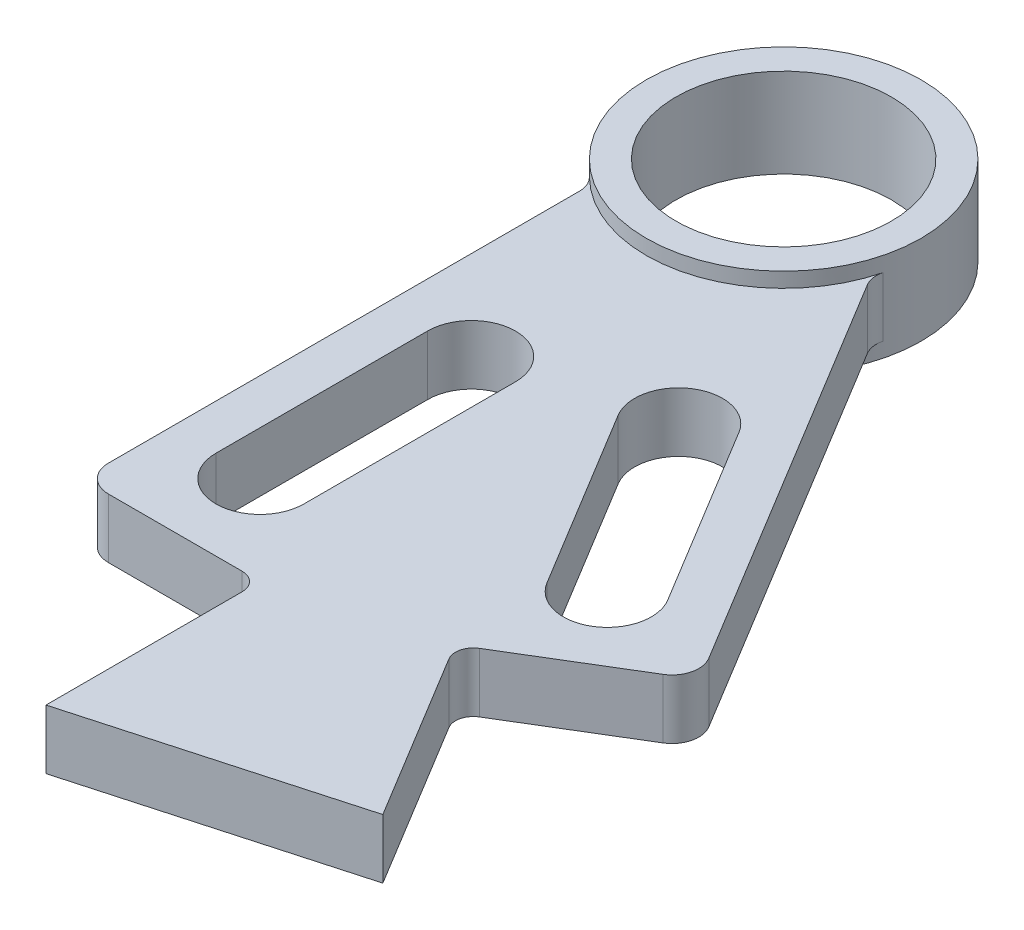
ISO-10303-21;
HEADER;
FILE_DESCRIPTION(('STEP AP214'),'2;1');
FILE_NAME('part.step','',(''),(''),'','','');
FILE_SCHEMA(('AUTOMOTIVE_DESIGN { 1 0 10303 214 1 1 1 1 }'));
ENDSEC;
DATA;
#1=APPLICATION_CONTEXT('core data for automotive mechanical design processes');
#2=APPLICATION_PROTOCOL_DEFINITION('international standard','automotive_design',2000,#1);
#3=PRODUCT_CONTEXT('',#1,'mechanical');
#4=PRODUCT('Part','Part','',(#3));
#5=PRODUCT_RELATED_PRODUCT_CATEGORY('part','',(#4));
#6=PRODUCT_DEFINITION_FORMATION('','',#4);
#7=PRODUCT_DEFINITION_CONTEXT('part definition',#1,'design');
#8=PRODUCT_DEFINITION('design','',#6,#7);
#9=PRODUCT_DEFINITION_SHAPE('','',#8);
#10=(LENGTH_UNIT() NAMED_UNIT(*) SI_UNIT(.MILLI.,.METRE.));
#11=(NAMED_UNIT(*) PLANE_ANGLE_UNIT() SI_UNIT($,.RADIAN.));
#12=(NAMED_UNIT(*) SI_UNIT($,.STERADIAN.) SOLID_ANGLE_UNIT());
#13=UNCERTAINTY_MEASURE_WITH_UNIT(LENGTH_MEASURE(1.E-05),#10,'distance_accuracy_value','');
#14=(GEOMETRIC_REPRESENTATION_CONTEXT(3) GLOBAL_UNCERTAINTY_ASSIGNED_CONTEXT((#13)) GLOBAL_UNIT_ASSIGNED_CONTEXT((#10,
#11,#12)) REPRESENTATION_CONTEXT('',''));
#15=CARTESIAN_POINT('',(0.,0.,0.));
#16=DIRECTION('',(0.,0.,1.));
#17=DIRECTION('',(1.,0.,0.));
#18=AXIS2_PLACEMENT_3D('',#15,#16,#17);
#19=CARTESIAN_POINT('',(0.,4.7625,0.));
#20=DIRECTION('',(0.,-1.,0.));
#21=DIRECTION('',(0.,0.,-1.));
#22=AXIS2_PLACEMENT_3D('',#19,#20,#21);
#23=CYLINDRICAL_SURFACE('',#22,11.5062);
#24=CARTESIAN_POINT('',(0.,4.7625,0.));
#25=DIRECTION('',(0.,1.,0.));
#26=DIRECTION('',(0.,0.,1.));
#27=AXIS2_PLACEMENT_3D('',#24,#25,#26);
#28=CIRCLE('',#27,11.5062);
#29=CARTESIAN_POINT('',(0.,4.7625,-11.5062));
#30=VERTEX_POINT('',#29);
#31=EDGE_CURVE('E309',#30,#30,#28,.T.);
#32=CARTESIAN_POINT('',(0.,-4.7625,0.));
#33=DIRECTION('',(0.,1.,0.));
#34=DIRECTION('',(0.,0.,1.));
#35=AXIS2_PLACEMENT_3D('',#32,#33,#34);
#36=CIRCLE('',#35,11.5062);
#37=CARTESIAN_POINT('',(0.,-4.7625,-11.5062));
#38=VERTEX_POINT('',#37);
#39=EDGE_CURVE('E300',#38,#38,#36,.T.);
#40=CARTESIAN_POINT('',(0.,4.7625,-11.5062));
#41=CARTESIAN_POINT('',(0.,4.66328125,-11.5062));
#42=CARTESIAN_POINT('',(0.,4.5640625,-11.5062));
#43=CARTESIAN_POINT('',(0.,4.365625,-11.5062));
#44=CARTESIAN_POINT('',(0.,4.26640625,-11.5062));
#45=CARTESIAN_POINT('',(0.,4.06796875,-11.5062));
#46=CARTESIAN_POINT('',(0.,3.96875,-11.5062));
#47=CARTESIAN_POINT('',(0.,3.7703125,-11.5062));
#48=CARTESIAN_POINT('',(0.,3.67109375,-11.5062));
#49=CARTESIAN_POINT('',(0.,3.47265625,-11.5062));
#50=CARTESIAN_POINT('',(0.,3.3734375,-11.5062));
#51=CARTESIAN_POINT('',(0.,3.175,-11.5062));
#52=CARTESIAN_POINT('',(0.,3.07578125,-11.5062));
#53=CARTESIAN_POINT('',(0.,2.87734375,-11.5062));
#54=CARTESIAN_POINT('',(0.,2.778125,-11.5062));
#55=CARTESIAN_POINT('',(0.,2.5796875,-11.5062));
#56=CARTESIAN_POINT('',(0.,2.48046875,-11.5062));
#57=CARTESIAN_POINT('',(0.,2.28203125,-11.5062));
#58=CARTESIAN_POINT('',(0.,2.1828125,-11.5062));
#59=CARTESIAN_POINT('',(0.,1.984375,-11.5062));
#60=CARTESIAN_POINT('',(0.,1.88515625,-11.5062));
#61=CARTESIAN_POINT('',(0.,1.68671875,-11.5062));
#62=CARTESIAN_POINT('',(0.,1.5875,-11.5062));
#63=CARTESIAN_POINT('',(0.,1.3890625,-11.5062));
#64=CARTESIAN_POINT('',(0.,1.28984375,-11.5062));
#65=CARTESIAN_POINT('',(0.,1.09140625,-11.5062));
#66=CARTESIAN_POINT('',(0.,0.992187499999999,-11.5062));
#67=CARTESIAN_POINT('',(0.,0.79375,-11.5062));
#68=CARTESIAN_POINT('',(0.,0.69453125,-11.5062));
#69=CARTESIAN_POINT('',(0.,0.49609375,-11.5062));
#70=CARTESIAN_POINT('',(0.,0.396875,-11.5062));
#71=CARTESIAN_POINT('',(0.,0.1984375,-11.5062));
#72=CARTESIAN_POINT('',(0.,0.0992187500000001,-11.5062));
#73=CARTESIAN_POINT('',(0.,-0.0992187500000001,-11.5062));
#74=CARTESIAN_POINT('',(0.,-0.1984375,-11.5062));
#75=CARTESIAN_POINT('',(0.,-0.396875,-11.5062));
#76=CARTESIAN_POINT('',(0.,-0.49609375,-11.5062));
#77=CARTESIAN_POINT('',(0.,-0.69453125,-11.5062));
#78=CARTESIAN_POINT('',(0.,-0.793750000000001,-11.5062));
#79=CARTESIAN_POINT('',(0.,-0.992187500000001,-11.5062));
#80=CARTESIAN_POINT('',(0.,-1.09140625,-11.5062));
#81=CARTESIAN_POINT('',(0.,-1.28984375,-11.5062));
#82=CARTESIAN_POINT('',(0.,-1.3890625,-11.5062));
#83=CARTESIAN_POINT('',(0.,-1.5875,-11.5062));
#84=CARTESIAN_POINT('',(0.,-1.68671875,-11.5062));
#85=CARTESIAN_POINT('',(0.,-1.88515625,-11.5062));
#86=CARTESIAN_POINT('',(0.,-1.984375,-11.5062));
#87=CARTESIAN_POINT('',(0.,-2.1828125,-11.5062));
#88=CARTESIAN_POINT('',(0.,-2.28203125,-11.5062));
#89=CARTESIAN_POINT('',(0.,-2.48046875,-11.5062));
#90=CARTESIAN_POINT('',(0.,-2.5796875,-11.5062));
#91=CARTESIAN_POINT('',(0.,-2.778125,-11.5062));
#92=CARTESIAN_POINT('',(0.,-2.87734375,-11.5062));
#93=CARTESIAN_POINT('',(0.,-3.07578125,-11.5062));
#94=CARTESIAN_POINT('',(0.,-3.175,-11.5062));
#95=CARTESIAN_POINT('',(0.,-3.3734375,-11.5062));
#96=CARTESIAN_POINT('',(0.,-3.47265625,-11.5062));
#97=CARTESIAN_POINT('',(0.,-3.67109375,-11.5062));
#98=CARTESIAN_POINT('',(0.,-3.7703125,-11.5062));
#99=CARTESIAN_POINT('',(0.,-3.96875,-11.5062));
#100=CARTESIAN_POINT('',(0.,-4.06796875,-11.5062));
#101=CARTESIAN_POINT('',(0.,-4.26640625,-11.5062));
#102=CARTESIAN_POINT('',(0.,-4.365625,-11.5062));
#103=CARTESIAN_POINT('',(0.,-4.5640625,-11.5062));
#104=CARTESIAN_POINT('',(0.,-4.66328125,-11.5062));
#105=CARTESIAN_POINT('',(0.,-4.7625,-11.5062));
#106=B_SPLINE_CURVE_WITH_KNOTS('',3,(#40,#41,#42,#43,#44,#45,#46,#47,#48,#49,#50,#51,#52,#53,
#54,#55,#56,#57,#58,#59,#60,#61,#62,#63,#64,#65,#66,#67,#68,#69,#70,#71,#72,#73,#74,#75,#76,#77,
#78,#79,#80,#81,#82,#83,#84,#85,#86,#87,#88,#89,#90,#91,#92,#93,#94,#95,#96,#97,#98,#99,#100,
#101,#102,#103,#104,#105),.UNSPECIFIED.,.F.,.F.,(4,2,2,2,2,2,2,2,2,2,2,2,2,2,2,2,2,2,2,2,2,2,2,
2,2,2,2,2,2,2,2,2,4),(0.,0.29765625,0.5953125,0.892968750000001,1.190625,1.48828125,1.7859375,
2.08359375,2.38125,2.67890625,2.9765625,3.27421875,3.571875,3.86953125,4.1671875,4.46484375,
4.7625,5.06015625,5.3578125,5.65546875,5.953125,6.25078125,6.5484375,6.84609375,7.14375,
7.44140625,7.7390625,8.03671875,8.334375,8.63203125,8.9296875,9.22734375,9.525),.UNSPECIFIED.);
#107=EDGE_CURVE('BSEAM45',#30,#38,#106,.T.);
#108=ORIENTED_EDGE('',*,*,#31,.T.);
#109=ORIENTED_EDGE('',*,*,#39,.F.);
#110=ORIENTED_EDGE('',*,*,#107,.T.);
#111=ORIENTED_EDGE('',*,*,#107,.F.);
#112=EDGE_LOOP('',(#108,#110,#109,#111));
#113=FACE_BOUND('',#112,.T.);
#114=ADVANCED_FACE('F45',(#113),#23,.F.);
#115=CARTESIAN_POINT('',(0.,4.7625,0.));
#116=DIRECTION('',(0.,-1.,0.));
#117=DIRECTION('',(0.,0.,-1.));
#118=AXIS2_PLACEMENT_3D('',#115,#116,#117);
#119=CYLINDRICAL_SURFACE('',#118,14.6812);
#120=DIRECTION('',(0.,-1.,0.));
#121=VECTOR('',#120,1.);
#122=CARTESIAN_POINT('',(14.2263906039101,4.7625,3.62594040560217));
#123=LINE('',#122,#121);
#124=CARTESIAN_POINT('',(14.2263906039101,3.175,3.62594040560217));
#125=VERTEX_POINT('',#124);
#126=CARTESIAN_POINT('',(14.2263906039101,-3.175,3.62594040560217));
#127=VERTEX_POINT('',#126);
#128=EDGE_CURVE('E323',#125,#127,#123,.T.);
#129=ORIENTED_EDGE('',*,*,#128,.T.);
#130=CARTESIAN_POINT('',(0.,-3.175,0.));
#131=DIRECTION('',(0.,1.,0.));
#132=DIRECTION('',(0.,0.,1.));
#133=AXIS2_PLACEMENT_3D('',#130,#131,#132);
#134=CIRCLE('',#133,14.6812);
#135=CARTESIAN_POINT('',(-10.2855014749263,-3.175,10.4759769400896));
#136=VERTEX_POINT('',#135);
#137=EDGE_CURVE('E269',#136,#127,#134,.T.);
#138=ORIENTED_EDGE('',*,*,#137,.F.);
#139=DIRECTION('',(0.,-1.,0.));
#140=VECTOR('',#139,1.);
#141=CARTESIAN_POINT('',(-10.2855014749263,4.7625,10.4759769400896));
#142=LINE('',#141,#140);
#143=CARTESIAN_POINT('',(-10.2855014749263,3.175,10.4759769400896));
#144=VERTEX_POINT('',#143);
#145=EDGE_CURVE('E316',#136,#144,#142,.F.);
#146=ORIENTED_EDGE('',*,*,#145,.T.);
#147=CARTESIAN_POINT('',(0.,3.175,0.));
#148=DIRECTION('',(0.,1.,0.));
#149=DIRECTION('',(0.,0.,1.));
#150=AXIS2_PLACEMENT_3D('',#147,#148,#149);
#151=CIRCLE('',#150,14.6812);
#152=EDGE_CURVE('E230',#144,#125,#151,.T.);
#153=ORIENTED_EDGE('',*,*,#152,.T.);
#154=EDGE_LOOP('',(#129,#138,#146,#153));
#155=FACE_BOUND('',#154,.T.);
#156=CARTESIAN_POINT('',(0.,4.7625,0.));
#157=DIRECTION('',(0.,1.,0.));
#158=DIRECTION('',(0.,0.,1.));
#159=AXIS2_PLACEMENT_3D('',#156,#157,#158);
#160=CIRCLE('',#159,14.6812);
#161=CARTESIAN_POINT('',(0.,4.7625,14.6812));
#162=VERTEX_POINT('',#161);
#163=EDGE_CURVE('E312',#162,#162,#160,.T.);
#164=ORIENTED_EDGE('',*,*,#163,.F.);
#165=EDGE_LOOP('',(#164));
#166=FACE_BOUND('',#165,.T.);
#167=CARTESIAN_POINT('',(0.,-4.7625,0.));
#168=DIRECTION('',(0.,1.,0.));
#169=DIRECTION('',(0.,0.,1.));
#170=AXIS2_PLACEMENT_3D('',#167,#168,#169);
#171=CIRCLE('',#170,14.6812);
#172=CARTESIAN_POINT('',(0.,-4.7625,14.6812));
#173=VERTEX_POINT('',#172);
#174=EDGE_CURVE('E313',#173,#173,#171,.T.);
#175=ORIENTED_EDGE('',*,*,#174,.T.);
#176=EDGE_LOOP('',(#175));
#177=FACE_BOUND('',#176,.T.);
#178=ADVANCED_FACE('F428',(#155,#166,#177),#119,.T.);
#179=CARTESIAN_POINT('',(0.,4.7625,0.));
#180=DIRECTION('',(0.,1.,0.));
#181=DIRECTION('',(0.,0.,1.));
#182=AXIS2_PLACEMENT_3D('',#179,#180,#181);
#183=PLANE('',#182);
#184=ORIENTED_EDGE('',*,*,#31,.F.);
#185=EDGE_LOOP('',(#184));
#186=FACE_BOUND('',#185,.T.);
#187=ORIENTED_EDGE('',*,*,#163,.T.);
#188=EDGE_LOOP('',(#187));
#189=FACE_BOUND('',#188,.T.);
#190=ADVANCED_FACE('F447',(#186,#189),#183,.T.);
#191=CARTESIAN_POINT('',(0.,-4.7625,0.));
#192=DIRECTION('',(0.,1.,0.));
#193=DIRECTION('',(0.,0.,1.));
#194=AXIS2_PLACEMENT_3D('',#191,#192,#193);
#195=PLANE('',#194);
#196=ORIENTED_EDGE('',*,*,#39,.T.);
#197=EDGE_LOOP('',(#196));
#198=FACE_BOUND('',#197,.T.);
#199=ORIENTED_EDGE('',*,*,#174,.F.);
#200=EDGE_LOOP('',(#199));
#201=FACE_BOUND('',#200,.T.);
#202=ADVANCED_FACE('F628',(#198,#201),#195,.F.);
#203=CARTESIAN_POINT('',(0.,3.175,33.3502));
#204=DIRECTION('',(0.,-1.,0.));
#205=DIRECTION('',(0.,0.,-1.));
#206=AXIS2_PLACEMENT_3D('',#203,#204,#205);
#207=CYLINDRICAL_SURFACE('',#206,4.699);
#208=CARTESIAN_POINT('',(0.,-3.175,33.3502));
#209=DIRECTION('',(0.,1.,0.));
#210=DIRECTION('',(0.,0.,1.));
#211=AXIS2_PLACEMENT_3D('',#208,#209,#210);
#212=CIRCLE('',#211,4.699);
#213=CARTESIAN_POINT('',(4.699,-3.175,33.3502));
#214=VERTEX_POINT('',#213);
#215=CARTESIAN_POINT('',(-4.699,-3.175,33.3502));
#216=VERTEX_POINT('',#215);
#217=EDGE_CURVE('E280',#214,#216,#212,.T.);
#218=ORIENTED_EDGE('',*,*,#217,.F.);
#219=DIRECTION('',(0.,-1.,0.));
#220=VECTOR('',#219,1.);
#221=CARTESIAN_POINT('',(4.699,3.175,33.3502));
#222=LINE('',#221,#220);
#223=CARTESIAN_POINT('',(4.699,3.175,33.3502));
#224=VERTEX_POINT('',#223);
#225=EDGE_CURVE('E298',#224,#214,#222,.T.);
#226=ORIENTED_EDGE('',*,*,#225,.F.);
#227=CARTESIAN_POINT('',(0.,3.175,33.3502));
#228=DIRECTION('',(0.,1.,0.));
#229=DIRECTION('',(0.,0.,1.));
#230=AXIS2_PLACEMENT_3D('',#227,#228,#229);
#231=CIRCLE('',#230,4.699);
#232=CARTESIAN_POINT('',(-4.699,3.175,33.3502));
#233=VERTEX_POINT('',#232);
#234=EDGE_CURVE('E241',#224,#233,#231,.T.);
#235=ORIENTED_EDGE('',*,*,#234,.T.);
#236=DIRECTION('',(0.,-1.,0.));
#237=VECTOR('',#236,1.);
#238=CARTESIAN_POINT('',(-4.699,3.175,33.3502));
#239=LINE('',#238,#237);
#240=EDGE_CURVE('E291',#233,#216,#239,.T.);
#241=ORIENTED_EDGE('',*,*,#240,.T.);
#242=EDGE_LOOP('',(#218,#226,#235,#241));
#243=FACE_BOUND('',#242,.T.);
#244=ADVANCED_FACE('F619',(#243),#207,.F.);
#245=CARTESIAN_POINT('',(4.699,3.175,0.));
#246=DIRECTION('',(-1.,0.,0.));
#247=DIRECTION('',(0.,0.,1.));
#248=AXIS2_PLACEMENT_3D('',#245,#246,#247);
#249=PLANE('',#248);
#250=DIRECTION('',(0.,0.,-1.));
#251=VECTOR('',#250,1.);
#252=CARTESIAN_POINT('',(4.699,-3.175,0.));
#253=LINE('',#252,#251);
#254=CARTESIAN_POINT('',(4.699,-3.175,55.9562));
#255=VERTEX_POINT('',#254);
#256=EDGE_CURVE('E283',#255,#214,#253,.T.);
#257=ORIENTED_EDGE('',*,*,#256,.F.);
#258=DIRECTION('',(0.,-1.,0.));
#259=VECTOR('',#258,1.);
#260=CARTESIAN_POINT('',(4.699,3.175,55.9562));
#261=LINE('',#260,#259);
#262=CARTESIAN_POINT('',(4.699,3.175,55.9562));
#263=VERTEX_POINT('',#262);
#264=EDGE_CURVE('E296',#263,#255,#261,.T.);
#265=ORIENTED_EDGE('',*,*,#264,.F.);
#266=DIRECTION('',(0.,0.,-1.));
#267=VECTOR('',#266,1.);
#268=CARTESIAN_POINT('',(4.699,3.175,0.));
#269=LINE('',#268,#267);
#270=EDGE_CURVE('E244',#263,#224,#269,.T.);
#271=ORIENTED_EDGE('',*,*,#270,.T.);
#272=ORIENTED_EDGE('',*,*,#225,.T.);
#273=EDGE_LOOP('',(#257,#265,#271,#272));
#274=FACE_BOUND('',#273,.T.);
#275=ADVANCED_FACE('F610',(#274),#249,.T.);
#276=CARTESIAN_POINT('',(0.,3.175,55.9562));
#277=DIRECTION('',(0.,-1.,0.));
#278=DIRECTION('',(0.,0.,-1.));
#279=AXIS2_PLACEMENT_3D('',#276,#277,#278);
#280=CYLINDRICAL_SURFACE('',#279,4.699);
#281=CARTESIAN_POINT('',(0.,-3.175,55.9562));
#282=DIRECTION('',(0.,1.,0.));
#283=DIRECTION('',(0.,0.,1.));
#284=AXIS2_PLACEMENT_3D('',#281,#282,#283);
#285=CIRCLE('',#284,4.699);
#286=CARTESIAN_POINT('',(-4.699,-3.175,55.9562));
#287=VERTEX_POINT('',#286);
#288=EDGE_CURVE('E286',#287,#255,#285,.T.);
#289=ORIENTED_EDGE('',*,*,#288,.F.);
#290=DIRECTION('',(0.,-1.,0.));
#291=VECTOR('',#290,1.);
#292=CARTESIAN_POINT('',(-4.699,3.175,55.9562));
#293=LINE('',#292,#291);
#294=CARTESIAN_POINT('',(-4.699,3.175,55.9562));
#295=VERTEX_POINT('',#294);
#296=EDGE_CURVE('E293',#295,#287,#293,.T.);
#297=ORIENTED_EDGE('',*,*,#296,.F.);
#298=CARTESIAN_POINT('',(0.,3.175,55.9562));
#299=DIRECTION('',(0.,1.,0.));
#300=DIRECTION('',(0.,0.,1.));
#301=AXIS2_PLACEMENT_3D('',#298,#299,#300);
#302=CIRCLE('',#301,4.699);
#303=EDGE_CURVE('E247',#295,#263,#302,.T.);
#304=ORIENTED_EDGE('',*,*,#303,.T.);
#305=ORIENTED_EDGE('',*,*,#264,.T.);
#306=EDGE_LOOP('',(#289,#297,#304,#305));
#307=FACE_BOUND('',#306,.T.);
#308=ADVANCED_FACE('F602',(#307),#280,.F.);
#309=CARTESIAN_POINT('',(-8.14503074966691,3.175,4.93802582890944));
#310=DIRECTION('',(0.855121338547725,0.,-0.518427908546934));
#311=DIRECTION('',(-0.518427908546934,0.,-0.855121338547725));
#312=AXIS2_PLACEMENT_3D('',#309,#310,#311);
#313=PLANE('',#312);
#314=DIRECTION('',(0.518427908546934,0.,0.855121338547725));
#315=VECTOR('',#314,1.);
#316=CARTESIAN_POINT('',(-8.14503074966691,-3.175,4.93802582890944));
#317=LINE('',#316,#315);
#318=CARTESIAN_POINT('',(26.7898559812585,-3.175,62.5614033725541));
#319=VERTEX_POINT('',#318);
#320=CARTESIAN_POINT('',(37.6535128048595,-3.175,80.4804710218217));
#321=VERTEX_POINT('',#320);
#322=EDGE_CURVE('E262',#319,#321,#317,.T.);
#323=ORIENTED_EDGE('',*,*,#322,.F.);
#324=DIRECTION('',(0.,-1.,0.));
#325=VECTOR('',#324,1.);
#326=CARTESIAN_POINT('',(26.7898559812585,3.175,62.5614033725541));
#327=LINE('',#326,#325);
#328=CARTESIAN_POINT('',(26.7898559812585,3.175,62.5614033725541));
#329=VERTEX_POINT('',#328);
#330=EDGE_CURVE('E347',#319,#329,#327,.F.);
#331=ORIENTED_EDGE('',*,*,#330,.T.);
#332=DIRECTION('',(0.518427908546934,0.,0.855121338547725));
#333=VECTOR('',#332,1.);
#334=CARTESIAN_POINT('',(-8.14503074966691,3.175,4.93802582890944));
#335=LINE('',#334,#333);
#336=CARTESIAN_POINT('',(37.6535128048595,3.175,80.4804710218217));
#337=VERTEX_POINT('',#336);
#338=EDGE_CURVE('E223',#329,#337,#335,.T.);
#339=ORIENTED_EDGE('',*,*,#338,.T.);
#340=DIRECTION('',(0.,-1.,0.));
#341=VECTOR('',#340,1.);
#342=CARTESIAN_POINT('',(37.6535128048595,3.175,80.4804710218217));
#343=LINE('',#342,#341);
#344=EDGE_CURVE('E203',#337,#321,#343,.T.);
#345=ORIENTED_EDGE('',*,*,#344,.T.);
#346=EDGE_LOOP('',(#323,#331,#339,#345));
#347=FACE_BOUND('',#346,.T.);
#348=ADVANCED_FACE('F472',(#347),#313,.T.);
#349=CARTESIAN_POINT('',(33.9472815651437,3.175,55.9943713937111));
#350=DIRECTION('',(-0.518427908546937,0.,-0.855121338547722));
#351=DIRECTION('',(-0.855121338547723,0.,0.518427908546937));
#352=AXIS2_PLACEMENT_3D('',#349,#350,#351);
#353=PLANE('',#352);
#354=DIRECTION('',(0.855121338547722,0.,-0.518427908546937));
#355=VECTOR('',#354,1.);
#356=CARTESIAN_POINT('',(33.9472815651437,-3.175,55.9943713937111));
#357=LINE('',#356,#355);
#358=CARTESIAN_POINT('',(27.43125696541,-3.175,59.9447920568388));
#359=VERTEX_POINT('',#358);
#360=CARTESIAN_POINT('',(39.6488030899106,-3.175,52.5377533134744));
#361=VERTEX_POINT('',#360);
#362=EDGE_CURVE('E264',#359,#361,#357,.T.);
#363=ORIENTED_EDGE('',*,*,#362,.T.);
#364=DIRECTION('',(0.,-1.,0.));
#365=VECTOR('',#364,1.);
#366=CARTESIAN_POINT('',(39.6488030899106,3.175,52.5377533134744));
#367=LINE('',#366,#365);
#368=CARTESIAN_POINT('',(39.6488030899106,3.175,52.5377533134744));
#369=VERTEX_POINT('',#368);
#370=EDGE_CURVE('E371',#361,#369,#367,.F.);
#371=ORIENTED_EDGE('',*,*,#370,.T.);
#372=DIRECTION('',(0.855121338547722,0.,-0.518427908546937));
#373=VECTOR('',#372,1.);
#374=CARTESIAN_POINT('',(33.9472815651437,3.175,55.9943713937111));
#375=LINE('',#374,#373);
#376=CARTESIAN_POINT('',(27.43125696541,3.175,59.9447920568388));
#377=VERTEX_POINT('',#376);
#378=EDGE_CURVE('E225',#377,#369,#375,.T.);
#379=ORIENTED_EDGE('',*,*,#378,.F.);
#380=DIRECTION('',(0.,-1.,0.));
#381=VECTOR('',#380,1.);
#382=CARTESIAN_POINT('',(27.43125696541,3.175,59.9447920568388));
#383=LINE('',#382,#381);
#384=EDGE_CURVE('E344',#377,#359,#383,.T.);
#385=ORIENTED_EDGE('',*,*,#384,.T.);
#386=EDGE_LOOP('',(#363,#371,#379,#385));
#387=FACE_BOUND('',#386,.T.);
#388=ADVANCED_FACE('F411',(#387),#353,.F.);
#389=CARTESIAN_POINT('',(8.14503074966698,3.175,-4.93802582890954));
#390=DIRECTION('',(-0.855121338547722,0.,0.518427908546937));
#391=DIRECTION('',(0.518427908546938,0.,0.855121338547722));
#392=AXIS2_PLACEMENT_3D('',#389,#390,#391);
#393=PLANE('',#392);
#394=DIRECTION('',(-0.518427908546938,0.,-0.855121338547722));
#395=VECTOR('',#394,1.);
#396=CARTESIAN_POINT('',(8.14503074966698,3.175,-4.93802582890954));
#397=LINE('',#396,#395);
#398=CARTESIAN_POINT('',(40.6109045661378,3.175,48.6128363399015));
#399=VERTEX_POINT('',#398);
#400=CARTESIAN_POINT('',(14.5156956572705,3.175,5.57007262300034));
#401=VERTEX_POINT('',#400);
#402=EDGE_CURVE('E228',#399,#401,#397,.T.);
#403=ORIENTED_EDGE('',*,*,#402,.F.);
#404=DIRECTION('',(0.,-1.,0.));
#405=VECTOR('',#404,1.);
#406=CARTESIAN_POINT('',(40.6109045661378,3.175,48.6128363399015));
#407=LINE('',#406,#405);
#408=CARTESIAN_POINT('',(40.6109045661378,-3.175,48.6128363399015));
#409=VERTEX_POINT('',#408);
#410=EDGE_CURVE('E364',#399,#409,#407,.T.);
#411=ORIENTED_EDGE('',*,*,#410,.T.);
#412=DIRECTION('',(-0.518427908546938,0.,-0.855121338547722));
#413=VECTOR('',#412,1.);
#414=CARTESIAN_POINT('',(8.14503074966698,-3.175,-4.93802582890954));
#415=LINE('',#414,#413);
#416=CARTESIAN_POINT('',(14.5156956572705,-3.175,5.57007262300034));
#417=VERTEX_POINT('',#416);
#418=EDGE_CURVE('E267',#409,#417,#415,.T.);
#419=ORIENTED_EDGE('',*,*,#418,.T.);
#420=DIRECTION('',(0.,1.,0.));
#421=VECTOR('',#420,1.);
#422=CARTESIAN_POINT('',(14.5156956572705,3.175,5.57007262300034));
#423=LINE('',#422,#421);
#424=EDGE_CURVE('E326',#417,#401,#423,.T.);
#425=ORIENTED_EDGE('',*,*,#424,.T.);
#426=EDGE_LOOP('',(#403,#411,#419,#425));
#427=FACE_BOUND('',#426,.T.);
#428=ADVANCED_FACE('F420',(#427),#393,.F.);
#429=CARTESIAN_POINT('',(-9.525,3.175,0.));
#430=DIRECTION('',(-1.,0.,0.));
#431=DIRECTION('',(0.,0.,1.));
#432=AXIS2_PLACEMENT_3D('',#429,#430,#431);
#433=PLANE('',#432);
#434=DIRECTION('',(0.,0.,-1.));
#435=VECTOR('',#434,1.);
#436=CARTESIAN_POINT('',(-9.525,-3.175,0.));
#437=LINE('',#436,#435);
#438=CARTESIAN_POINT('',(-9.525,-3.175,62.6237));
#439=VERTEX_POINT('',#438);
#440=CARTESIAN_POINT('',(-9.525,-3.175,12.2884296978906));
#441=VERTEX_POINT('',#440);
#442=EDGE_CURVE('E271',#439,#441,#437,.T.);
#443=ORIENTED_EDGE('',*,*,#442,.F.);
#444=DIRECTION('',(0.,-1.,0.));
#445=VECTOR('',#444,1.);
#446=CARTESIAN_POINT('',(-9.525,3.175,62.6237));
#447=LINE('',#446,#445);
#448=CARTESIAN_POINT('',(-9.525,3.175,62.6237));
#449=VERTEX_POINT('',#448);
#450=EDGE_CURVE('E11',#439,#449,#447,.F.);
#451=ORIENTED_EDGE('',*,*,#450,.T.);
#452=DIRECTION('',(0.,0.,-1.));
#453=VECTOR('',#452,1.);
#454=CARTESIAN_POINT('',(-9.525,3.175,0.));
#455=LINE('',#454,#453);
#456=CARTESIAN_POINT('',(-9.525,3.175,12.2884296978906));
#457=VERTEX_POINT('',#456);
#458=EDGE_CURVE('E232',#449,#457,#455,.T.);
#459=ORIENTED_EDGE('',*,*,#458,.T.);
#460=DIRECTION('',(0.,-1.,0.));
#461=VECTOR('',#460,1.);
#462=CARTESIAN_POINT('',(-9.525,3.175,12.2884296978906));
#463=LINE('',#462,#461);
#464=EDGE_CURVE('E329',#457,#441,#463,.T.);
#465=ORIENTED_EDGE('',*,*,#464,.T.);
#466=EDGE_LOOP('',(#443,#451,#459,#465));
#467=FACE_BOUND('',#466,.T.);
#468=ADVANCED_FACE('F481',(#467),#433,.T.);
#469=CARTESIAN_POINT('',(0.,3.175,65.4812));
#470=DIRECTION('',(0.,0.,-1.));
#471=DIRECTION('',(-1.,0.,0.));
#472=AXIS2_PLACEMENT_3D('',#469,#470,#471);
#473=PLANE('',#472);
#474=DIRECTION('',(1.,0.,0.));
#475=VECTOR('',#474,1.);
#476=CARTESIAN_POINT('',(0.,3.175,65.4812));
#477=LINE('',#476,#475);
#478=CARTESIAN_POINT('',(-6.6675,3.175,65.4812));
#479=VERTEX_POINT('',#478);
#480=CARTESIAN_POINT('',(7.62,3.175,65.4812));
#481=VERTEX_POINT('',#480);
#482=EDGE_CURVE('E234',#479,#481,#477,.T.);
#483=ORIENTED_EDGE('',*,*,#482,.F.);
#484=DIRECTION('',(0.,-1.,0.));
#485=VECTOR('',#484,1.);
#486=CARTESIAN_POINT('',(-6.6675,-3.175,65.4812));
#487=LINE('',#486,#485);
#488=CARTESIAN_POINT('',(-6.6675,-3.175,65.4812));
#489=VERTEX_POINT('',#488);
#490=EDGE_CURVE('E53',#479,#489,#487,.T.);
#491=ORIENTED_EDGE('',*,*,#490,.T.);
#492=DIRECTION('',(1.,0.,0.));
#493=VECTOR('',#492,1.);
#494=CARTESIAN_POINT('',(0.,-3.175,65.4812));
#495=LINE('',#494,#493);
#496=CARTESIAN_POINT('',(7.62,-3.175,65.4812));
#497=VERTEX_POINT('',#496);
#498=EDGE_CURVE('E273',#489,#497,#495,.T.);
#499=ORIENTED_EDGE('',*,*,#498,.T.);
#500=DIRECTION('',(0.,-1.,0.));
#501=VECTOR('',#500,1.);
#502=CARTESIAN_POINT('',(7.62,3.175,65.4812));
#503=LINE('',#502,#501);
#504=EDGE_CURVE('E352',#497,#481,#503,.F.);
#505=ORIENTED_EDGE('',*,*,#504,.T.);
#506=EDGE_LOOP('',(#483,#491,#499,#505));
#507=FACE_BOUND('',#506,.T.);
#508=ADVANCED_FACE('F379',(#507),#473,.F.);
#509=CARTESIAN_POINT('',(9.525,3.175,0.));
#510=DIRECTION('',(1.,0.,0.));
#511=DIRECTION('',(0.,0.,-1.));
#512=AXIS2_PLACEMENT_3D('',#509,#510,#511);
#513=PLANE('',#512);
#514=DIRECTION('',(0.,0.,1.));
#515=VECTOR('',#514,1.);
#516=CARTESIAN_POINT('',(9.525,3.175,0.));
#517=LINE('',#516,#515);
#518=CARTESIAN_POINT('',(9.525,3.175,67.3862));
#519=VERTEX_POINT('',#518);
#520=CARTESIAN_POINT('',(9.525,3.175,88.3412));
#521=VERTEX_POINT('',#520);
#522=EDGE_CURVE('E236',#519,#521,#517,.T.);
#523=ORIENTED_EDGE('',*,*,#522,.F.);
#524=DIRECTION('',(0.,-1.,0.));
#525=VECTOR('',#524,1.);
#526=CARTESIAN_POINT('',(9.525,-3.175,67.3862));
#527=LINE('',#526,#525);
#528=CARTESIAN_POINT('',(9.525,-3.175,67.3862));
#529=VERTEX_POINT('',#528);
#530=EDGE_CURVE('E349',#519,#529,#527,.T.);
#531=ORIENTED_EDGE('',*,*,#530,.T.);
#532=DIRECTION('',(0.,0.,1.));
#533=VECTOR('',#532,1.);
#534=CARTESIAN_POINT('',(9.525,-3.175,0.));
#535=LINE('',#534,#533);
#536=CARTESIAN_POINT('',(9.525,-3.175,88.3412));
#537=VERTEX_POINT('',#536);
#538=EDGE_CURVE('E275',#529,#537,#535,.T.);
#539=ORIENTED_EDGE('',*,*,#538,.T.);
#540=DIRECTION('',(0.,-1.,0.));
#541=VECTOR('',#540,1.);
#542=CARTESIAN_POINT('',(9.525,3.175,88.3412));
#543=LINE('',#542,#541);
#544=EDGE_CURVE('E294',#521,#537,#543,.T.);
#545=ORIENTED_EDGE('',*,*,#544,.F.);
#546=EDGE_LOOP('',(#523,#531,#539,#545));
#547=FACE_BOUND('',#546,.T.);
#548=ADVANCED_FACE('F397',(#547),#513,.F.);
#549=CARTESIAN_POINT('',(29.0092557362341,3.175,47.8493406440441));
#550=DIRECTION('',(0.,-1.,0.));
#551=DIRECTION('',(0.,0.,-1.));
#552=AXIS2_PLACEMENT_3D('',#549,#550,#551);
#553=CYLINDRICAL_SURFACE('',#552,4.69900000000001);
#554=CARTESIAN_POINT('',(29.0092557362341,-3.175,47.8493406440441));
#555=DIRECTION('',(0.,1.,0.));
#556=DIRECTION('',(0.,0.,1.));
#557=AXIS2_PLACEMENT_3D('',#554,#555,#556);
#558=CIRCLE('',#557,4.69900000000001);
#559=CARTESIAN_POINT('',(24.9910405663983,-3.175,50.2854333863062));
#560=VERTEX_POINT('',#559);
#561=CARTESIAN_POINT('',(33.0274709060698,-3.175,45.413247901782));
#562=VERTEX_POINT('',#561);
#563=EDGE_CURVE('E198',#560,#562,#558,.T.);
#564=ORIENTED_EDGE('',*,*,#563,.F.);
#565=DIRECTION('',(0.,-1.,0.));
#566=VECTOR('',#565,1.);
#567=CARTESIAN_POINT('',(24.9910405663983,3.175,50.2854333863062));
#568=LINE('',#567,#566);
#569=CARTESIAN_POINT('',(24.9910405663983,3.175,50.2854333863062));
#570=VERTEX_POINT('',#569);
#571=EDGE_CURVE('E193',#570,#560,#568,.T.);
#572=ORIENTED_EDGE('',*,*,#571,.F.);
#573=CARTESIAN_POINT('',(29.0092557362341,3.175,47.8493406440441));
#574=DIRECTION('',(0.,1.,0.));
#575=DIRECTION('',(0.,0.,1.));
#576=AXIS2_PLACEMENT_3D('',#573,#574,#575);
#577=CIRCLE('',#576,4.69900000000001);
#578=CARTESIAN_POINT('',(33.0274709060698,3.175,45.413247901782));
#579=VERTEX_POINT('',#578);
#580=EDGE_CURVE('E196',#570,#579,#577,.T.);
#581=ORIENTED_EDGE('',*,*,#580,.T.);
#582=DIRECTION('',(0.,-1.,0.));
#583=VECTOR('',#582,1.);
#584=CARTESIAN_POINT('',(33.0274709060698,3.175,45.413247901782));
#585=LINE('',#584,#583);
#586=EDGE_CURVE('E252',#579,#562,#585,.T.);
#587=ORIENTED_EDGE('',*,*,#586,.T.);
#588=EDGE_LOOP('',(#564,#572,#581,#587));
#589=FACE_BOUND('',#588,.T.);
#590=ADVANCED_FACE('F195',(#589),#553,.F.);
#591=CARTESIAN_POINT('',(-4.01821516983578,3.175,2.43609274226207));
#592=DIRECTION('',(0.855121338547723,0.,-0.518427908546937));
#593=DIRECTION('',(-0.518427908546937,0.,-0.855121338547723));
#594=AXIS2_PLACEMENT_3D('',#591,#592,#593);
#595=PLANE('',#594);
#596=DIRECTION('',(0.518427908546937,0.,0.855121338547723));
#597=VECTOR('',#596,1.);
#598=CARTESIAN_POINT('',(-4.01821516983578,-3.175,2.43609274226207));
#599=LINE('',#598,#597);
#600=CARTESIAN_POINT('',(13.2714592657863,-3.175,30.9545604070963));
#601=VERTEX_POINT('',#600);
#602=EDGE_CURVE('E254',#601,#560,#599,.T.);
#603=ORIENTED_EDGE('',*,*,#602,.F.);
#604=DIRECTION('',(0.,-1.,0.));
#605=VECTOR('',#604,1.);
#606=CARTESIAN_POINT('',(13.2714592657863,3.175,30.9545604070963));
#607=LINE('',#606,#605);
#608=CARTESIAN_POINT('',(13.2714592657863,3.175,30.9545604070963));
#609=VERTEX_POINT('',#608);
#610=EDGE_CURVE('E204',#609,#601,#607,.T.);
#611=ORIENTED_EDGE('',*,*,#610,.F.);
#612=DIRECTION('',(0.518427908546937,0.,0.855121338547723));
#613=VECTOR('',#612,1.);
#614=CARTESIAN_POINT('',(-4.01821516983578,3.175,2.43609274226207));
#615=LINE('',#614,#613);
#616=EDGE_CURVE('E210',#609,#570,#615,.T.);
#617=ORIENTED_EDGE('',*,*,#616,.T.);
#618=ORIENTED_EDGE('',*,*,#571,.T.);
#619=EDGE_LOOP('',(#603,#611,#617,#618));
#620=FACE_BOUND('',#619,.T.);
#621=ADVANCED_FACE('F217',(#620),#595,.T.);
#622=CARTESIAN_POINT('',(17.2896744356222,3.175,28.5184676648342));
#623=DIRECTION('',(0.,-1.,0.));
#624=DIRECTION('',(0.,0.,-1.));
#625=AXIS2_PLACEMENT_3D('',#622,#623,#624);
#626=CYLINDRICAL_SURFACE('',#625,4.69900000000001);
#627=CARTESIAN_POINT('',(17.2896744356222,-3.175,28.5184676648342));
#628=DIRECTION('',(0.,1.,0.));
#629=DIRECTION('',(0.,0.,1.));
#630=AXIS2_PLACEMENT_3D('',#627,#628,#629);
#631=CIRCLE('',#630,4.69900000000001);
#632=CARTESIAN_POINT('',(21.3078896054578,-3.175,26.0823749225722));
#633=VERTEX_POINT('',#632);
#634=EDGE_CURVE('E256',#633,#601,#631,.T.);
#635=ORIENTED_EDGE('',*,*,#634,.F.);
#636=DIRECTION('',(0.,-1.,0.));
#637=VECTOR('',#636,1.);
#638=CARTESIAN_POINT('',(21.3078896054578,3.175,26.0823749225722));
#639=LINE('',#638,#637);
#640=CARTESIAN_POINT('',(21.3078896054578,3.175,26.0823749225722));
#641=VERTEX_POINT('',#640);
#642=EDGE_CURVE('E306',#641,#633,#639,.T.);
#643=ORIENTED_EDGE('',*,*,#642,.F.);
#644=CARTESIAN_POINT('',(17.2896744356222,3.175,28.5184676648342));
#645=DIRECTION('',(0.,1.,0.));
#646=DIRECTION('',(0.,0.,1.));
#647=AXIS2_PLACEMENT_3D('',#644,#645,#646);
#648=CIRCLE('',#647,4.69900000000001);
#649=EDGE_CURVE('E218',#641,#609,#648,.T.);
#650=ORIENTED_EDGE('',*,*,#649,.T.);
#651=ORIENTED_EDGE('',*,*,#610,.T.);
#652=EDGE_LOOP('',(#635,#643,#650,#651));
#653=FACE_BOUND('',#652,.T.);
#654=ADVANCED_FACE('F564',(#653),#626,.F.);
#655=CARTESIAN_POINT('',(23.5892564024297,3.175,84.4108355109108));
#656=DIRECTION('',(-0.269145556764622,0.,-0.963099511615421));
#657=DIRECTION('',(-0.963099511615421,0.,0.269145556764622));
#658=AXIS2_PLACEMENT_3D('',#655,#656,#657);
#659=PLANE('',#658);
#660=DIRECTION('',(0.963099511615421,0.,-0.269145556764622));
#661=VECTOR('',#660,1.);
#662=CARTESIAN_POINT('',(23.5892564024297,-3.175,84.4108355109108));
#663=LINE('',#662,#661);
#664=EDGE_CURVE('E277',#537,#321,#663,.T.);
#665=ORIENTED_EDGE('',*,*,#664,.T.);
#666=ORIENTED_EDGE('',*,*,#344,.F.);
#667=DIRECTION('',(0.963099511615421,0.,-0.269145556764622));
#668=VECTOR('',#667,1.);
#669=CARTESIAN_POINT('',(23.5892564024297,3.175,84.4108355109108));
#670=LINE('',#669,#668);
#671=EDGE_CURVE('E238',#521,#337,#670,.T.);
#672=ORIENTED_EDGE('',*,*,#671,.F.);
#673=ORIENTED_EDGE('',*,*,#544,.T.);
#674=EDGE_LOOP('',(#665,#666,#672,#673));
#675=FACE_BOUND('',#674,.T.);
#676=ADVANCED_FACE('F399',(#675),#659,.F.);
#677=CARTESIAN_POINT('',(4.01821516983571,3.175,-2.43609274226203));
#678=DIRECTION('',(0.855121338547722,0.,-0.518427908546937));
#679=DIRECTION('',(-0.518427908546937,0.,-0.855121338547722));
#680=AXIS2_PLACEMENT_3D('',#677,#678,#679);
#681=PLANE('',#680);
#682=DIRECTION('',(0.518427908546937,0.,0.855121338547722));
#683=VECTOR('',#682,1.);
#684=CARTESIAN_POINT('',(4.01821516983571,-3.175,-2.43609274226203));
#685=LINE('',#684,#683);
#686=EDGE_CURVE('E259',#633,#562,#685,.T.);
#687=ORIENTED_EDGE('',*,*,#686,.T.);
#688=ORIENTED_EDGE('',*,*,#586,.F.);
#689=DIRECTION('',(0.518427908546937,0.,0.855121338547722));
#690=VECTOR('',#689,1.);
#691=CARTESIAN_POINT('',(4.01821516983571,3.175,-2.43609274226203));
#692=LINE('',#691,#690);
#693=EDGE_CURVE('E213',#641,#579,#692,.T.);
#694=ORIENTED_EDGE('',*,*,#693,.F.);
#695=ORIENTED_EDGE('',*,*,#642,.T.);
#696=EDGE_LOOP('',(#687,#688,#694,#695));
#697=FACE_BOUND('',#696,.T.);
#698=ADVANCED_FACE('F547',(#697),#681,.F.);
#699=CARTESIAN_POINT('',(-4.699,3.175,0.));
#700=DIRECTION('',(-1.,0.,0.));
#701=DIRECTION('',(0.,0.,1.));
#702=AXIS2_PLACEMENT_3D('',#699,#700,#701);
#703=PLANE('',#702);
#704=DIRECTION('',(0.,0.,-1.));
#705=VECTOR('',#704,1.);
#706=CARTESIAN_POINT('',(-4.699,-3.175,0.));
#707=LINE('',#706,#705);
#708=EDGE_CURVE('E215',#287,#216,#707,.T.);
#709=ORIENTED_EDGE('',*,*,#708,.T.);
#710=ORIENTED_EDGE('',*,*,#240,.F.);
#711=DIRECTION('',(0.,0.,-1.));
#712=VECTOR('',#711,1.);
#713=CARTESIAN_POINT('',(-4.699,3.175,0.));
#714=LINE('',#713,#712);
#715=EDGE_CURVE('E250',#295,#233,#714,.T.);
#716=ORIENTED_EDGE('',*,*,#715,.F.);
#717=ORIENTED_EDGE('',*,*,#296,.T.);
#718=EDGE_LOOP('',(#709,#710,#716,#717));
#719=FACE_BOUND('',#718,.T.);
#720=ADVANCED_FACE('F504',(#719),#703,.F.);
#721=CARTESIAN_POINT('',(0.,3.175,0.));
#722=DIRECTION('',(0.,1.,0.));
#723=DIRECTION('',(0.,0.,1.));
#724=AXIS2_PLACEMENT_3D('',#721,#722,#723);
#725=PLANE('',#724);
#726=ORIENTED_EDGE('',*,*,#580,.F.);
#727=ORIENTED_EDGE('',*,*,#616,.F.);
#728=ORIENTED_EDGE('',*,*,#649,.F.);
#729=ORIENTED_EDGE('',*,*,#693,.T.);
#730=EDGE_LOOP('',(#726,#727,#728,#729));
#731=FACE_BOUND('',#730,.T.);
#732=ORIENTED_EDGE('',*,*,#378,.T.);
#733=CARTESIAN_POINT('',(38.1673953412377,3.175,50.0942440885743));
#734=DIRECTION('',(0.,1.,0.));
#735=DIRECTION('',(0.,0.,1.));
#736=AXIS2_PLACEMENT_3D('',#733,#734,#735);
#737=CIRCLE('',#736,2.8575);
#738=EDGE_CURVE('E374',#369,#399,#737,.T.);
#739=ORIENTED_EDGE('',*,*,#738,.T.);
#740=ORIENTED_EDGE('',*,*,#402,.T.);
#741=CARTESIAN_POINT('',(16.6877038571817,3.175,4.25326573529112));
#742=DIRECTION('',(0.,1.,0.));
#743=DIRECTION('',(0.,0.,1.));
#744=AXIS2_PLACEMENT_3D('',#741,#742,#743);
#745=CIRCLE('',#744,2.54);
#746=EDGE_CURVE('E335',#401,#125,#745,.F.);
#747=ORIENTED_EDGE('',*,*,#746,.T.);
#748=ORIENTED_EDGE('',*,*,#152,.F.);
#749=CARTESIAN_POINT('',(-12.065,3.175,12.2884296978906));
#750=DIRECTION('',(0.,1.,0.));
#751=DIRECTION('',(0.,0.,1.));
#752=AXIS2_PLACEMENT_3D('',#749,#750,#751);
#753=CIRCLE('',#752,2.54);
#754=EDGE_CURVE('E341',#144,#457,#753,.F.);
#755=ORIENTED_EDGE('',*,*,#754,.T.);
#756=ORIENTED_EDGE('',*,*,#458,.F.);
#757=CARTESIAN_POINT('',(-6.6675,3.175,62.6237));
#758=DIRECTION('',(0.,1.,0.));
#759=DIRECTION('',(0.,0.,1.));
#760=AXIS2_PLACEMENT_3D('',#757,#758,#759);
#761=CIRCLE('',#760,2.8575);
#762=EDGE_CURVE('E60',#449,#479,#761,.T.);
#763=ORIENTED_EDGE('',*,*,#762,.T.);
#764=ORIENTED_EDGE('',*,*,#482,.T.);
#765=CARTESIAN_POINT('',(7.62,3.175,67.3862));
#766=DIRECTION('',(0.,1.,0.));
#767=DIRECTION('',(0.,0.,1.));
#768=AXIS2_PLACEMENT_3D('',#765,#766,#767);
#769=CIRCLE('',#768,1.905);
#770=EDGE_CURVE('E362',#481,#519,#769,.F.);
#771=ORIENTED_EDGE('',*,*,#770,.T.);
#772=ORIENTED_EDGE('',*,*,#522,.T.);
#773=ORIENTED_EDGE('',*,*,#671,.T.);
#774=ORIENTED_EDGE('',*,*,#338,.F.);
#775=CARTESIAN_POINT('',(28.4188621311919,3.175,61.5737982067722));
#776=DIRECTION('',(0.,1.,0.));
#777=DIRECTION('',(0.,0.,1.));
#778=AXIS2_PLACEMENT_3D('',#775,#776,#777);
#779=CIRCLE('',#778,1.905);
#780=EDGE_CURVE('E357',#329,#377,#779,.F.);
#781=ORIENTED_EDGE('',*,*,#780,.T.);
#782=EDGE_LOOP('',(#732,#739,#740,#747,#748,#755,#756,#763,#764,#771,#772,#773,#774,#781));
#783=FACE_BOUND('',#782,.T.);
#784=ORIENTED_EDGE('',*,*,#234,.F.);
#785=ORIENTED_EDGE('',*,*,#270,.F.);
#786=ORIENTED_EDGE('',*,*,#303,.F.);
#787=ORIENTED_EDGE('',*,*,#715,.T.);
#788=EDGE_LOOP('',(#784,#785,#786,#787));
#789=FACE_BOUND('',#788,.T.);
#790=ADVANCED_FACE('F208',(#731,#783,#789),#725,.T.);
#791=CARTESIAN_POINT('',(0.,-3.175,0.));
#792=DIRECTION('',(0.,1.,0.));
#793=DIRECTION('',(0.,0.,1.));
#794=AXIS2_PLACEMENT_3D('',#791,#792,#793);
#795=PLANE('',#794);
#796=ORIENTED_EDGE('',*,*,#563,.T.);
#797=ORIENTED_EDGE('',*,*,#686,.F.);
#798=ORIENTED_EDGE('',*,*,#634,.T.);
#799=ORIENTED_EDGE('',*,*,#602,.T.);
#800=EDGE_LOOP('',(#796,#797,#798,#799));
#801=FACE_BOUND('',#800,.T.);
#802=ORIENTED_EDGE('',*,*,#418,.F.);
#803=CARTESIAN_POINT('',(38.1673953412377,-3.175,50.0942440885743));
#804=DIRECTION('',(0.,1.,0.));
#805=DIRECTION('',(0.,0.,1.));
#806=AXIS2_PLACEMENT_3D('',#803,#804,#805);
#807=CIRCLE('',#806,2.8575);
#808=EDGE_CURVE('E369',#409,#361,#807,.F.);
#809=ORIENTED_EDGE('',*,*,#808,.T.);
#810=ORIENTED_EDGE('',*,*,#362,.F.);
#811=CARTESIAN_POINT('',(28.4188621311919,-3.175,61.5737982067722));
#812=DIRECTION('',(0.,1.,0.));
#813=DIRECTION('',(0.,0.,1.));
#814=AXIS2_PLACEMENT_3D('',#811,#812,#813);
#815=CIRCLE('',#814,1.905);
#816=EDGE_CURVE('E355',#359,#319,#815,.T.);
#817=ORIENTED_EDGE('',*,*,#816,.T.);
#818=ORIENTED_EDGE('',*,*,#322,.T.);
#819=ORIENTED_EDGE('',*,*,#664,.F.);
#820=ORIENTED_EDGE('',*,*,#538,.F.);
#821=CARTESIAN_POINT('',(7.62,-3.175,67.3862));
#822=DIRECTION('',(0.,1.,0.));
#823=DIRECTION('',(0.,0.,1.));
#824=AXIS2_PLACEMENT_3D('',#821,#822,#823);
#825=CIRCLE('',#824,1.905);
#826=EDGE_CURVE('E359',#529,#497,#825,.T.);
#827=ORIENTED_EDGE('',*,*,#826,.T.);
#828=ORIENTED_EDGE('',*,*,#498,.F.);
#829=CARTESIAN_POINT('',(-6.6675,-3.175,62.6237));
#830=DIRECTION('',(0.,1.,0.));
#831=DIRECTION('',(0.,0.,1.));
#832=AXIS2_PLACEMENT_3D('',#829,#830,#831);
#833=CIRCLE('',#832,2.8575);
#834=EDGE_CURVE('E367',#489,#439,#833,.F.);
#835=ORIENTED_EDGE('',*,*,#834,.T.);
#836=ORIENTED_EDGE('',*,*,#442,.T.);
#837=CARTESIAN_POINT('',(-12.065,-3.175,12.2884296978906));
#838=DIRECTION('',(0.,1.,0.));
#839=DIRECTION('',(0.,0.,1.));
#840=AXIS2_PLACEMENT_3D('',#837,#838,#839);
#841=CIRCLE('',#840,2.54);
#842=EDGE_CURVE('E338',#441,#136,#841,.T.);
#843=ORIENTED_EDGE('',*,*,#842,.T.);
#844=ORIENTED_EDGE('',*,*,#137,.T.);
#845=CARTESIAN_POINT('',(16.6877038571817,-3.175,4.25326573529112));
#846=DIRECTION('',(0.,1.,0.));
#847=DIRECTION('',(0.,0.,1.));
#848=AXIS2_PLACEMENT_3D('',#845,#846,#847);
#849=CIRCLE('',#848,2.54);
#850=EDGE_CURVE('E332',#127,#417,#849,.T.);
#851=ORIENTED_EDGE('',*,*,#850,.T.);
#852=EDGE_LOOP('',(#802,#809,#810,#817,#818,#819,#820,#827,#828,#835,#836,#843,#844,#851));
#853=FACE_BOUND('',#852,.T.);
#854=ORIENTED_EDGE('',*,*,#217,.T.);
#855=ORIENTED_EDGE('',*,*,#708,.F.);
#856=ORIENTED_EDGE('',*,*,#288,.T.);
#857=ORIENTED_EDGE('',*,*,#256,.T.);
#858=EDGE_LOOP('',(#854,#855,#856,#857));
#859=FACE_BOUND('',#858,.T.);
#860=ADVANCED_FACE('F383',(#801,#853,#859),#795,.F.);
#861=CARTESIAN_POINT('',(16.6877038571817,4.7625,4.25326573529112));
#862=DIRECTION('',(0.,-1.,0.));
#863=DIRECTION('',(0.,0.,-1.));
#864=AXIS2_PLACEMENT_3D('',#861,#862,#863);
#865=CYLINDRICAL_SURFACE('',#864,2.54);
#866=ORIENTED_EDGE('',*,*,#746,.F.);
#867=ORIENTED_EDGE('',*,*,#424,.F.);
#868=ORIENTED_EDGE('',*,*,#850,.F.);
#869=ORIENTED_EDGE('',*,*,#128,.F.);
#870=EDGE_LOOP('',(#866,#867,#868,#869));
#871=FACE_BOUND('',#870,.T.);
#872=ADVANCED_FACE('F426',(#871),#865,.F.);
#873=CARTESIAN_POINT('',(-12.065,4.7625,12.2884296978906));
#874=DIRECTION('',(0.,-1.,0.));
#875=DIRECTION('',(0.,0.,-1.));
#876=AXIS2_PLACEMENT_3D('',#873,#874,#875);
#877=CYLINDRICAL_SURFACE('',#876,2.54);
#878=ORIENTED_EDGE('',*,*,#754,.F.);
#879=ORIENTED_EDGE('',*,*,#145,.F.);
#880=ORIENTED_EDGE('',*,*,#842,.F.);
#881=ORIENTED_EDGE('',*,*,#464,.F.);
#882=EDGE_LOOP('',(#878,#879,#880,#881));
#883=FACE_BOUND('',#882,.T.);
#884=ADVANCED_FACE('F435',(#883),#877,.F.);
#885=CARTESIAN_POINT('',(28.4188621311919,3.175,61.5737982067722));
#886=DIRECTION('',(0.,-1.,0.));
#887=DIRECTION('',(0.,0.,-1.));
#888=AXIS2_PLACEMENT_3D('',#885,#886,#887);
#889=CYLINDRICAL_SURFACE('',#888,1.905);
#890=ORIENTED_EDGE('',*,*,#780,.F.);
#891=ORIENTED_EDGE('',*,*,#330,.F.);
#892=ORIENTED_EDGE('',*,*,#816,.F.);
#893=ORIENTED_EDGE('',*,*,#384,.F.);
#894=EDGE_LOOP('',(#890,#891,#892,#893));
#895=FACE_BOUND('',#894,.T.);
#896=ADVANCED_FACE('F408',(#895),#889,.F.);
#897=CARTESIAN_POINT('',(7.62,3.175,67.3862));
#898=DIRECTION('',(0.,1.,0.));
#899=DIRECTION('',(0.,0.,1.));
#900=AXIS2_PLACEMENT_3D('',#897,#898,#899);
#901=CYLINDRICAL_SURFACE('',#900,1.905);
#902=ORIENTED_EDGE('',*,*,#770,.F.);
#903=ORIENTED_EDGE('',*,*,#504,.F.);
#904=ORIENTED_EDGE('',*,*,#826,.F.);
#905=ORIENTED_EDGE('',*,*,#530,.F.);
#906=EDGE_LOOP('',(#902,#903,#904,#905));
#907=FACE_BOUND('',#906,.T.);
#908=ADVANCED_FACE('F391',(#907),#901,.F.);
#909=CARTESIAN_POINT('',(38.1673953412377,3.175,50.0942440885743));
#910=DIRECTION('',(0.,-1.,0.));
#911=DIRECTION('',(0.,0.,-1.));
#912=AXIS2_PLACEMENT_3D('',#909,#910,#911);
#913=CYLINDRICAL_SURFACE('',#912,2.8575);
#914=ORIENTED_EDGE('',*,*,#738,.F.);
#915=ORIENTED_EDGE('',*,*,#370,.F.);
#916=ORIENTED_EDGE('',*,*,#808,.F.);
#917=ORIENTED_EDGE('',*,*,#410,.F.);
#918=EDGE_LOOP('',(#914,#915,#916,#917));
#919=FACE_BOUND('',#918,.T.);
#920=ADVANCED_FACE('F417',(#919),#913,.T.);
#921=CARTESIAN_POINT('',(-6.6675,3.175,62.6237));
#922=DIRECTION('',(0.,1.,0.));
#923=DIRECTION('',(0.,0.,1.));
#924=AXIS2_PLACEMENT_3D('',#921,#922,#923);
#925=CYLINDRICAL_SURFACE('',#924,2.8575);
#926=ORIENTED_EDGE('',*,*,#762,.F.);
#927=ORIENTED_EDGE('',*,*,#450,.F.);
#928=ORIENTED_EDGE('',*,*,#834,.F.);
#929=ORIENTED_EDGE('',*,*,#490,.F.);
#930=EDGE_LOOP('',(#926,#927,#928,#929));
#931=FACE_BOUND('',#930,.T.);
#932=ADVANCED_FACE('F47',(#931),#925,.T.);
#933=CLOSED_SHELL('',(#114,#178,#190,#202,#244,#275,#308,#348,#388,#428,#468,#508,#548,#590,
#621,#654,#676,#698,#720,#790,#860,#872,#884,#896,#908,#920,#932));
#934=MANIFOLD_SOLID_BREP('B2',#933);
#935=ADVANCED_BREP_SHAPE_REPRESENTATION('',(#18,#934),#14);
#936=SHAPE_DEFINITION_REPRESENTATION(#9,#935);
ENDSEC;
END-ISO-10303-21;
